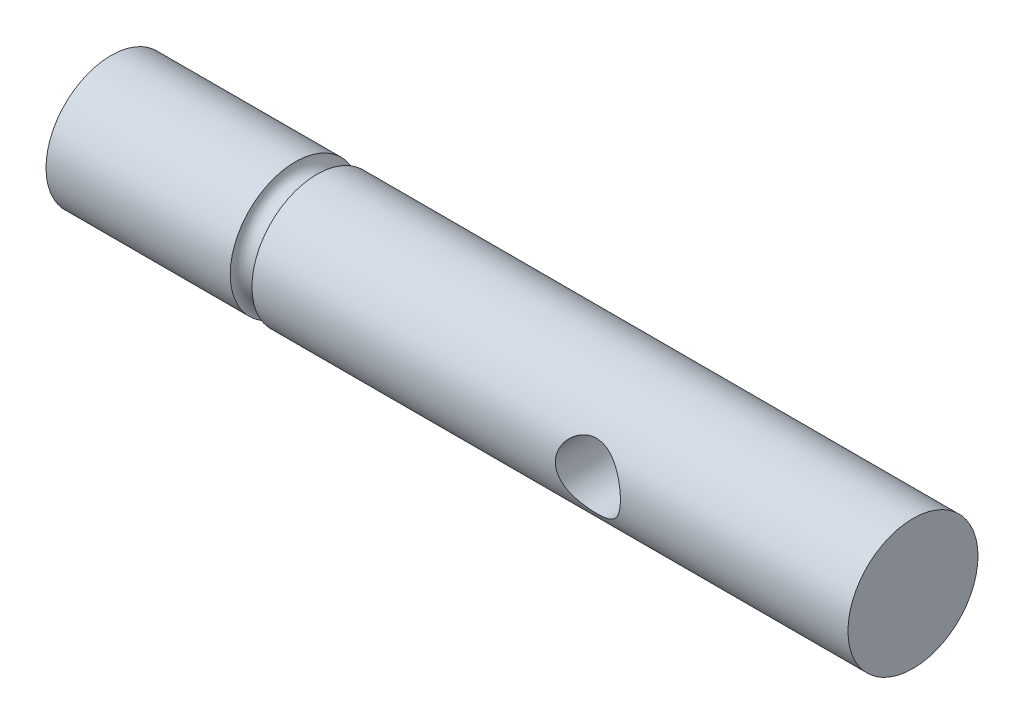
ISO-10303-21;
HEADER;
FILE_DESCRIPTION(('STEP AP214'),'2;1');
FILE_NAME('part.step','',(''),(''),'','','');
FILE_SCHEMA(('AUTOMOTIVE_DESIGN { 1 0 10303 214 1 1 1 1 }'));
ENDSEC;
DATA;
#1=APPLICATION_CONTEXT('core data for automotive mechanical design processes');
#2=APPLICATION_PROTOCOL_DEFINITION('international standard','automotive_design',2000,#1);
#3=PRODUCT_CONTEXT('',#1,'mechanical');
#4=PRODUCT('Part','Part','',(#3));
#5=PRODUCT_RELATED_PRODUCT_CATEGORY('part','',(#4));
#6=PRODUCT_DEFINITION_FORMATION('','',#4);
#7=PRODUCT_DEFINITION_CONTEXT('part definition',#1,'design');
#8=PRODUCT_DEFINITION('design','',#6,#7);
#9=PRODUCT_DEFINITION_SHAPE('','',#8);
#10=(LENGTH_UNIT() NAMED_UNIT(*) SI_UNIT(.MILLI.,.METRE.));
#11=(NAMED_UNIT(*) PLANE_ANGLE_UNIT() SI_UNIT($,.RADIAN.));
#12=(NAMED_UNIT(*) SI_UNIT($,.STERADIAN.) SOLID_ANGLE_UNIT());
#13=UNCERTAINTY_MEASURE_WITH_UNIT(LENGTH_MEASURE(1.E-05),#10,'distance_accuracy_value','');
#14=(GEOMETRIC_REPRESENTATION_CONTEXT(3) GLOBAL_UNCERTAINTY_ASSIGNED_CONTEXT((#13)) GLOBAL_UNIT_ASSIGNED_CONTEXT((#10,
#11,#12)) REPRESENTATION_CONTEXT('',''));
#15=CARTESIAN_POINT('',(0.,0.,0.));
#16=DIRECTION('',(0.,0.,1.));
#17=DIRECTION('',(1.,0.,0.));
#18=AXIS2_PLACEMENT_3D('',#15,#16,#17);
#19=CARTESIAN_POINT('',(18.5,0.,0.));
#20=DIRECTION('',(-1.,0.,0.));
#21=DIRECTION('',(0.,0.,1.));
#22=AXIS2_PLACEMENT_3D('',#19,#20,#21);
#23=CYLINDRICAL_SURFACE('',#22,3.);
#24=CARTESIAN_POINT('',(-10.,0.,0.));
#25=DIRECTION('',(1.,0.,0.));
#26=DIRECTION('',(0.,0.,-1.));
#27=AXIS2_PLACEMENT_3D('',#24,#25,#26);
#28=CIRCLE('',#27,3.);
#29=CARTESIAN_POINT('',(-10.,0.,3.));
#30=VERTEX_POINT('',#29);
#31=EDGE_CURVE('E12',#30,#30,#28,.F.);
#32=ORIENTED_EDGE('',*,*,#31,.T.);
#33=EDGE_LOOP('',(#32));
#34=FACE_BOUND('',#33,.T.);
#35=CARTESIAN_POINT('',(-18.5,0.,0.));
#36=DIRECTION('',(1.,0.,0.));
#37=DIRECTION('',(0.,0.,-1.));
#38=AXIS2_PLACEMENT_3D('',#35,#36,#37);
#39=CIRCLE('',#38,3.);
#40=CARTESIAN_POINT('',(-18.5,0.,-3.));
#41=VERTEX_POINT('',#40);
#42=EDGE_CURVE('E71',#41,#41,#39,.T.);
#43=ORIENTED_EDGE('',*,*,#42,.T.);
#44=EDGE_LOOP('',(#43));
#45=FACE_BOUND('',#44,.T.);
#46=ADVANCED_FACE('F53',(#34,#45),#23,.T.);
#47=CARTESIAN_POINT('',(-18.5,0.,0.));
#48=DIRECTION('',(1.,0.,0.));
#49=DIRECTION('',(0.,0.,-1.));
#50=AXIS2_PLACEMENT_3D('',#47,#48,#49);
#51=PLANE('',#50);
#52=ORIENTED_EDGE('',*,*,#42,.F.);
#53=EDGE_LOOP('',(#52));
#54=FACE_BOUND('',#53,.T.);
#55=ADVANCED_FACE('F105',(#54),#51,.F.);
#56=CARTESIAN_POINT('',(-9.5,0.,0.));
#57=DIRECTION('',(-1.,0.,0.));
#58=DIRECTION('',(0.,0.,1.));
#59=AXIS2_PLACEMENT_3D('',#56,#57,#58);
#60=TOROIDAL_SURFACE('',#59,3.,0.5);
#61=CARTESIAN_POINT('',(-9.5,0.,3.));
#62=DIRECTION('',(0.,1.,0.));
#63=DIRECTION('',(-1.,0.,0.));
#64=AXIS2_PLACEMENT_3D('',#61,#62,#63);
#65=CIRCLE('',#64,0.5);
#66=CARTESIAN_POINT('',(-9.,0.,3.));
#67=VERTEX_POINT('',#66);
#68=EDGE_CURVE('E70',#67,#30,#65,.T.);
#69=ORIENTED_EDGE('',*,*,#68,.F.);
#70=CARTESIAN_POINT('',(-9.,0.,0.));
#71=DIRECTION('',(-1.,0.,0.));
#72=DIRECTION('',(0.,0.,1.));
#73=AXIS2_PLACEMENT_3D('',#70,#71,#72);
#74=CIRCLE('',#73,3.);
#75=EDGE_CURVE('E62',#67,#67,#74,.F.);
#76=ORIENTED_EDGE('',*,*,#75,.F.);
#77=ORIENTED_EDGE('',*,*,#68,.T.);
#78=ORIENTED_EDGE('',*,*,#31,.F.);
#79=EDGE_LOOP('',(#69,#76,#77,#78));
#80=FACE_BOUND('',#79,.T.);
#81=ADVANCED_FACE('F72',(#80),#60,.F.);
#82=CARTESIAN_POINT('',(18.5,0.,0.));
#83=DIRECTION('',(1.,0.,0.));
#84=DIRECTION('',(0.,0.,-1.));
#85=AXIS2_PLACEMENT_3D('',#82,#83,#84);
#86=PLANE('',#85);
#87=CARTESIAN_POINT('',(18.5,0.,0.));
#88=DIRECTION('',(1.,0.,0.));
#89=DIRECTION('',(0.,0.,-1.));
#90=AXIS2_PLACEMENT_3D('',#87,#88,#89);
#91=CIRCLE('',#90,3.);
#92=CARTESIAN_POINT('',(18.5,0.,-3.));
#93=VERTEX_POINT('',#92);
#94=EDGE_CURVE('E78',#93,#93,#91,.T.);
#95=ORIENTED_EDGE('',*,*,#94,.T.);
#96=EDGE_LOOP('',(#95));
#97=FACE_BOUND('',#96,.T.);
#98=ADVANCED_FACE('F100',(#97),#86,.T.);
#99=CARTESIAN_POINT('',(6.5,0.,-3.));
#100=DIRECTION('',(0.,0.,1.));
#101=DIRECTION('',(1.,0.,0.));
#102=AXIS2_PLACEMENT_3D('',#99,#100,#101);
#103=CYLINDRICAL_SURFACE('',#102,1.5);
#104=CARTESIAN_POINT('',(8.,0.,3.));
#105=CARTESIAN_POINT('',(7.99999504652421,-0.0788579444268503,2.99999570107561));
#106=CARTESIAN_POINT('',(7.99374489031841,-0.157809899546344,2.99685736529635));
#107=CARTESIAN_POINT('',(7.96902067948769,-0.313380352903344,2.98461234055736));
#108=CARTESIAN_POINT('',(7.95052341050327,-0.389994130070445,2.97549431743379));
#109=CARTESIAN_POINT('',(7.90220928707506,-0.538400317320674,2.95224419105063));
#110=CARTESIAN_POINT('',(7.87243642362805,-0.61021020440872,2.93813158766306));
#111=CARTESIAN_POINT('',(7.80264406795252,-0.747708925209899,2.90618664773642));
#112=CARTESIAN_POINT('',(7.7626253836267,-0.813398240985089,2.88835460450288));
#113=CARTESIAN_POINT('',(7.67072412577207,-0.941261726642864,2.84934387387093));
#114=CARTESIAN_POINT('',(7.61827028114054,-1.00298281668316,2.82802798691306));
#115=CARTESIAN_POINT('',(7.50421778112945,-1.11716916730047,2.78489955370114));
#116=CARTESIAN_POINT('',(7.44261222234134,-1.16962737466015,2.76308664313552));
#117=CARTESIAN_POINT('',(7.30627497571493,-1.26787800067542,2.71948426796021));
#118=CARTESIAN_POINT('',(7.23089585248113,-1.31283800332746,2.69782780455198));
#119=CARTESIAN_POINT('',(7.07244899602068,-1.38925234033604,2.65928968158481));
#120=CARTESIAN_POINT('',(6.98938680691588,-1.4207163224495,2.64240461410484));
#121=CARTESIAN_POINT('',(6.82300234186712,-1.46719866328288,2.61686800556713));
#122=CARTESIAN_POINT('',(6.73999332189891,-1.48308878562066,2.6077840737557));
#123=CARTESIAN_POINT('',(6.57203174333078,-1.50064048996327,2.59772834922791));
#124=CARTESIAN_POINT('',(6.48708118869327,-1.50231613255961,2.59674854014932));
#125=CARTESIAN_POINT('',(6.32857096352695,-1.49203093075844,2.60266395385873));
#126=CARTESIAN_POINT('',(6.25486395316542,-1.48167683930523,2.6086314549302));
#127=CARTESIAN_POINT('',(6.11041713594044,-1.4504097735854,2.62614343100775));
#128=CARTESIAN_POINT('',(6.03967828204203,-1.42949343584648,2.63768968247664));
#129=CARTESIAN_POINT('',(5.90115630115151,-1.37731467057901,2.66531214619112));
#130=CARTESIAN_POINT('',(5.83348040182132,-1.34582260067399,2.68148760995998));
#131=CARTESIAN_POINT('',(5.70404856111499,-1.27356253150201,2.71655106422105));
#132=CARTESIAN_POINT('',(5.64229529659987,-1.2327903657187,2.73544027170286));
#133=CARTESIAN_POINT('',(5.51821812088516,-1.13709908236918,2.77669736854929));
#134=CARTESIAN_POINT('',(5.45681468963576,-1.08104168755392,2.79920265355119));
#135=CARTESIAN_POINT('',(5.34389687211365,-0.959333368112062,2.84321434950611));
#136=CARTESIAN_POINT('',(5.29238721194917,-0.89367788486143,2.86472027938201));
#137=CARTESIAN_POINT('',(5.19847150845541,-0.750774758747775,2.90552980924446));
#138=CARTESIAN_POINT('',(5.15659929133139,-0.673130387399115,2.92468476243011));
#139=CARTESIAN_POINT('',(5.08685445643548,-0.510699323233197,2.95736821681863));
#140=CARTESIAN_POINT('',(5.05897072247725,-0.425918364397916,2.9709011841533));
#141=CARTESIAN_POINT('',(5.02028689442498,-0.259149737491056,2.98986500612153));
#142=CARTESIAN_POINT('',(5.00826314637983,-0.177512295822492,2.99587407451965));
#143=CARTESIAN_POINT('',(4.99780290329827,-0.0131693999240297,3.00109520188655));
#144=CARTESIAN_POINT('',(4.9993599715408,0.0695355298048612,3.00031048081978));
#145=CARTESIAN_POINT('',(5.01531003262811,0.226849457978979,2.99236788380152));
#146=CARTESIAN_POINT('',(5.02869879909499,0.301589112074894,2.98570868532253));
#147=CARTESIAN_POINT('',(5.06635710784268,0.44761033845291,2.9673325697226));
#148=CARTESIAN_POINT('',(5.09062784968024,0.518891528536629,2.95561509501618));
#149=CARTESIAN_POINT('',(5.14999769964955,0.658332912674358,2.92776377120382));
#150=CARTESIAN_POINT('',(5.18538657517443,0.726345595508704,2.91151322654446));
#151=CARTESIAN_POINT('',(5.26566130346985,0.855692042548907,2.87615961476126));
#152=CARTESIAN_POINT('',(5.31055120189309,0.917022944664887,2.85705533350407));
#153=CARTESIAN_POINT('',(5.41364063799607,1.03765153393382,2.81562332004297));
#154=CARTESIAN_POINT('',(5.47271430266772,1.09615811672854,2.79316327265249));
#155=CARTESIAN_POINT('',(5.59988772691659,1.20278448167828,2.7489358741323));
#156=CARTESIAN_POINT('',(5.66799367827188,1.25089707856781,2.72716901100071));
#157=CARTESIAN_POINT('',(5.81546548125946,1.33756187171853,2.68576788309734));
#158=CARTESIAN_POINT('',(5.89521689914172,1.37553824370037,2.66628794383591));
#159=CARTESIAN_POINT('',(6.06126510136245,1.43712423890206,2.63361108441202));
#160=CARTESIAN_POINT('',(6.14755328970033,1.46075237380052,2.62040607332625));
#161=CARTESIAN_POINT('',(6.31536533432705,1.49079253120031,2.60342251538703));
#162=CARTESIAN_POINT('',(6.39655138015286,1.49863949460818,2.59886075197597));
#163=CARTESIAN_POINT('',(6.55917060074679,1.5010337315643,2.59748031962405));
#164=CARTESIAN_POINT('',(6.64060365310679,1.49558676993486,2.60065829439585));
#165=CARTESIAN_POINT('',(6.79322525230015,1.47288918838996,2.61356793076615));
#166=CARTESIAN_POINT('',(6.86465070521711,1.45681247151455,2.62264641723988));
#167=CARTESIAN_POINT('',(7.00371217913655,1.41476303733662,2.64556524281479));
#168=CARTESIAN_POINT('',(7.07134697313805,1.38878713673988,2.65940711354503));
#169=CARTESIAN_POINT('',(7.2059372764798,1.32572361795085,2.69142795546804));
#170=CARTESIAN_POINT('',(7.27254185274354,1.28800670672355,2.70983583593881));
#171=CARTESIAN_POINT('',(7.39891180427189,1.20322645745609,2.74852997452291));
#172=CARTESIAN_POINT('',(7.45867359578167,1.15615825686234,2.76881720693416));
#173=CARTESIAN_POINT('',(7.57721297353201,1.04730498999206,2.81193484737138));
#174=CARTESIAN_POINT('',(7.63498865352543,0.984426634495892,2.83477474959942));
#175=CARTESIAN_POINT('',(7.7393944751529,0.849232209349796,2.87816628389896));
#176=CARTESIAN_POINT('',(7.78601860920486,0.776911084957796,2.89871667939293));
#177=CARTESIAN_POINT('',(7.8668545440681,0.623897395174418,2.93547014349806));
#178=CARTESIAN_POINT('',(7.9009762538547,0.543149255665095,2.95164144740899));
#179=CARTESIAN_POINT('',(7.95471225163611,0.37611315170713,2.9775201194848));
#180=CARTESIAN_POINT('',(7.97436777020857,0.28984169938365,2.98724585044602));
#181=CARTESIAN_POINT('',(7.99084611662861,0.168902919736343,2.99543192870217));
#182=CARTESIAN_POINT('',(7.99427396129951,0.135242819162347,2.99714048010376));
#183=CARTESIAN_POINT('',(7.99885199827113,0.0677275977076369,2.99942545465223));
#184=CARTESIAN_POINT('',(8.00000212770531,0.0338724714699424,3.00000184655071));
#185=CARTESIAN_POINT('',(8.,0.,3.));
#186=B_SPLINE_CURVE_WITH_KNOTS('',3,(#104,#105,#106,#107,#108,#109,#110,#111,#112,#113,#114,
#115,#116,#117,#118,#119,#120,#121,#122,#123,#124,#125,#126,#127,#128,#129,#130,#131,#132,#133,
#134,#135,#136,#137,#138,#139,#140,#141,#142,#143,#144,#145,#146,#147,#148,#149,#150,#151,#152,
#153,#154,#155,#156,#157,#158,#159,#160,#161,#162,#163,#164,#165,#166,#167,#168,#169,#170,#171,
#172,#173,#174,#175,#176,#177,#178,#179,#180,#181,#182,#183,#184,#185),.UNSPECIFIED.,.T.,.F.,(4,
2,2,2,2,2,2,2,2,2,2,2,2,2,2,2,2,2,2,2,2,2,2,2,2,2,2,2,2,2,2,2,2,2,2,2,2,2,2,2,4),(0.,
0.236436386130439,0.473322224563797,0.709293233238448,0.945245640872352,1.19547263807713,
1.44588935648105,1.71572589646129,1.98536921847421,2.23887018210344,2.49212035993531,
2.71508568613981,2.93812205888518,3.16635360252731,3.39468781890333,3.65197412000818,
3.9093830189803,4.17874533321661,4.4478932536842,4.69474935707019,4.94148846767214,
5.16910359759183,5.39674382446398,5.63089284041848,5.86514176122509,6.12239415966629,
6.37982382923148,6.64972023242589,6.91926767918176,7.1629396125457,7.40650589797018,
7.62686895373284,7.84730293182527,8.08254685170431,8.31791341715446,8.58187864135757,
8.84598575071869,9.1119602049529,9.37717362931724,9.47872920200876,9.58028757766599),.UNSPECIFIED.);
#187=CARTESIAN_POINT('',(8.,0.,3.));
#188=VERTEX_POINT('',#187);
#189=EDGE_CURVE('E76',#188,#188,#186,.T.);
#190=ORIENTED_EDGE('',*,*,#189,.F.);
#191=EDGE_LOOP('',(#190));
#192=FACE_BOUND('',#191,.T.);
#193=CARTESIAN_POINT('',(8.,0.,-3.));
#194=CARTESIAN_POINT('',(7.99999504652421,0.0788579444268494,-2.99999570107562));
#195=CARTESIAN_POINT('',(7.99374489031841,0.157809899546343,-2.99685736529635));
#196=CARTESIAN_POINT('',(7.96902067948769,0.313380352903343,-2.98461234055736));
#197=CARTESIAN_POINT('',(7.95052341050328,0.389994130070444,-2.97549431743379));
#198=CARTESIAN_POINT('',(7.90220928707506,0.538400317320673,-2.95224419105063));
#199=CARTESIAN_POINT('',(7.87243642362805,0.610210204408719,-2.93813158766306));
#200=CARTESIAN_POINT('',(7.80264406795252,0.747708925209897,-2.90618664773642));
#201=CARTESIAN_POINT('',(7.7626253836267,0.813398240985088,-2.88835460450288));
#202=CARTESIAN_POINT('',(7.67072412577207,0.941261726642863,-2.84934387387093));
#203=CARTESIAN_POINT('',(7.61827028114054,1.00298281668316,-2.82802798691306));
#204=CARTESIAN_POINT('',(7.50421778112944,1.11716916730047,-2.78489955370115));
#205=CARTESIAN_POINT('',(7.44261222234134,1.16962737466015,-2.76308664313552));
#206=CARTESIAN_POINT('',(7.30627497571493,1.26787800067542,-2.71948426796021));
#207=CARTESIAN_POINT('',(7.23089585248113,1.31283800332746,-2.69782780455198));
#208=CARTESIAN_POINT('',(7.07244899602068,1.38925234033604,-2.65928968158481));
#209=CARTESIAN_POINT('',(6.98938680691588,1.4207163224495,-2.64240461410484));
#210=CARTESIAN_POINT('',(6.82300234186712,1.46719866328288,-2.61686800556713));
#211=CARTESIAN_POINT('',(6.73999332189891,1.48308878562066,-2.6077840737557));
#212=CARTESIAN_POINT('',(6.57203174333078,1.50064048996327,-2.59772834922792));
#213=CARTESIAN_POINT('',(6.48708118869327,1.50231613255961,-2.59674854014932));
#214=CARTESIAN_POINT('',(6.32857096352695,1.49203093075844,-2.60266395385873));
#215=CARTESIAN_POINT('',(6.25486395316542,1.48167683930523,-2.6086314549302));
#216=CARTESIAN_POINT('',(6.11041713594044,1.4504097735854,-2.62614343100775));
#217=CARTESIAN_POINT('',(6.03967828204202,1.42949343584648,-2.63768968247664));
#218=CARTESIAN_POINT('',(5.90115630115151,1.37731467057901,-2.66531214619112));
#219=CARTESIAN_POINT('',(5.83348040182132,1.34582260067399,-2.68148760995998));
#220=CARTESIAN_POINT('',(5.70404856111499,1.273562531502,-2.71655106422106));
#221=CARTESIAN_POINT('',(5.64229529659987,1.2327903657187,-2.73544027170286));
#222=CARTESIAN_POINT('',(5.51821812088516,1.13709908236918,-2.77669736854929));
#223=CARTESIAN_POINT('',(5.45681468963576,1.08104168755392,-2.79920265355119));
#224=CARTESIAN_POINT('',(5.34389687211365,0.95933336811206,-2.84321434950611));
#225=CARTESIAN_POINT('',(5.29238721194917,0.893677884861428,-2.86472027938201));
#226=CARTESIAN_POINT('',(5.19847150845541,0.750774758747773,-2.90552980924446));
#227=CARTESIAN_POINT('',(5.15659929133139,0.673130387399113,-2.92468476243011));
#228=CARTESIAN_POINT('',(5.08685445643548,0.510699323233195,-2.95736821681863));
#229=CARTESIAN_POINT('',(5.05897072247725,0.425918364397914,-2.9709011841533));
#230=CARTESIAN_POINT('',(5.02028689442498,0.259149737491053,-2.98986500612153));
#231=CARTESIAN_POINT('',(5.00826314637983,0.177512295822489,-2.99587407451965));
#232=CARTESIAN_POINT('',(4.99780290329827,0.0131693999240272,-3.00109520188655));
#233=CARTESIAN_POINT('',(4.9993599715408,-0.0695355298048633,-3.00031048081978));
#234=CARTESIAN_POINT('',(5.01531003262811,-0.226849457978981,-2.99236788380152));
#235=CARTESIAN_POINT('',(5.02869879909499,-0.301589112074895,-2.98570868532252));
#236=CARTESIAN_POINT('',(5.06635710784268,-0.447610338452912,-2.9673325697226));
#237=CARTESIAN_POINT('',(5.09062784968024,-0.518891528536631,-2.95561509501618));
#238=CARTESIAN_POINT('',(5.14999769964955,-0.658332912674359,-2.92776377120382));
#239=CARTESIAN_POINT('',(5.18538657517443,-0.726345595508705,-2.91151322654446));
#240=CARTESIAN_POINT('',(5.26566130346985,-0.855692042548907,-2.87615961476126));
#241=CARTESIAN_POINT('',(5.31055120189309,-0.917022944664888,-2.85705533350407));
#242=CARTESIAN_POINT('',(5.41364063799607,-1.03765153393382,-2.81562332004297));
#243=CARTESIAN_POINT('',(5.47271430266772,-1.09615811672854,-2.79316327265249));
#244=CARTESIAN_POINT('',(5.59988772691659,-1.20278448167828,-2.7489358741323));
#245=CARTESIAN_POINT('',(5.66799367827188,-1.25089707856781,-2.72716901100071));
#246=CARTESIAN_POINT('',(5.81546548125946,-1.33756187171853,-2.68576788309734));
#247=CARTESIAN_POINT('',(5.89521689914172,-1.37553824370037,-2.66628794383591));
#248=CARTESIAN_POINT('',(6.06126510136245,-1.43712423890206,-2.63361108441202));
#249=CARTESIAN_POINT('',(6.14755328970033,-1.46075237380053,-2.62040607332625));
#250=CARTESIAN_POINT('',(6.31536533432705,-1.49079253120031,-2.60342251538703));
#251=CARTESIAN_POINT('',(6.39655138015286,-1.49863949460818,-2.59886075197597));
#252=CARTESIAN_POINT('',(6.55917060074679,-1.5010337315643,-2.59748031962405));
#253=CARTESIAN_POINT('',(6.64060365310679,-1.49558676993486,-2.60065829439585));
#254=CARTESIAN_POINT('',(6.79322525230015,-1.47288918838997,-2.61356793076615));
#255=CARTESIAN_POINT('',(6.86465070521711,-1.45681247151455,-2.62264641723988));
#256=CARTESIAN_POINT('',(7.00371217913655,-1.41476303733662,-2.64556524281479));
#257=CARTESIAN_POINT('',(7.07134697313805,-1.38878713673988,-2.65940711354503));
#258=CARTESIAN_POINT('',(7.2059372764798,-1.32572361795085,-2.69142795546803));
#259=CARTESIAN_POINT('',(7.27254185274354,-1.28800670672355,-2.70983583593881));
#260=CARTESIAN_POINT('',(7.39891180427189,-1.20322645745609,-2.7485299745229));
#261=CARTESIAN_POINT('',(7.45867359578167,-1.15615825686235,-2.76881720693416));
#262=CARTESIAN_POINT('',(7.57721297353201,-1.04730498999206,-2.81193484737138));
#263=CARTESIAN_POINT('',(7.63498865352543,-0.984426634495894,-2.83477474959942));
#264=CARTESIAN_POINT('',(7.7393944751529,-0.849232209349797,-2.87816628389896));
#265=CARTESIAN_POINT('',(7.78601860920486,-0.776911084957797,-2.89871667939293));
#266=CARTESIAN_POINT('',(7.8668545440681,-0.62389739517442,-2.93547014349806));
#267=CARTESIAN_POINT('',(7.9009762538547,-0.543149255665097,-2.95164144740899));
#268=CARTESIAN_POINT('',(7.95471225163611,-0.376113151707131,-2.9775201194848));
#269=CARTESIAN_POINT('',(7.97436777020857,-0.289841699383652,-2.98724585044602));
#270=CARTESIAN_POINT('',(7.99084611662861,-0.168902919736345,-2.99543192870217));
#271=CARTESIAN_POINT('',(7.99427396129951,-0.135242819162349,-2.99714048010376));
#272=CARTESIAN_POINT('',(7.99885199827113,-0.0677275977076386,-2.99942545465223));
#273=CARTESIAN_POINT('',(8.00000212770531,-0.0338724714699437,-3.00000184655071));
#274=CARTESIAN_POINT('',(8.,0.,-3.));
#275=B_SPLINE_CURVE_WITH_KNOTS('',3,(#193,#194,#195,#196,#197,#198,#199,#200,#201,#202,#203,
#204,#205,#206,#207,#208,#209,#210,#211,#212,#213,#214,#215,#216,#217,#218,#219,#220,#221,#222,
#223,#224,#225,#226,#227,#228,#229,#230,#231,#232,#233,#234,#235,#236,#237,#238,#239,#240,#241,
#242,#243,#244,#245,#246,#247,#248,#249,#250,#251,#252,#253,#254,#255,#256,#257,#258,#259,#260,
#261,#262,#263,#264,#265,#266,#267,#268,#269,#270,#271,#272,#273,#274),.UNSPECIFIED.,.T.,.F.,(4,
2,2,2,2,2,2,2,2,2,2,2,2,2,2,2,2,2,2,2,2,2,2,2,2,2,2,2,2,2,2,2,2,2,2,2,2,2,2,2,4),(0.,
0.236436386130439,0.473322224563796,0.709293233238448,0.945245640872351,1.19547263807713,
1.44588935648105,1.71572589646129,1.98536921847421,2.23887018210344,2.49212035993531,
2.71508568613981,2.93812205888518,3.16635360252731,3.39468781890333,3.65197412000818,
3.9093830189803,4.17874533321661,4.44789325368419,4.69474935707019,4.94148846767214,
5.16910359759183,5.39674382446397,5.63089284041848,5.86514176122509,6.12239415966628,
6.37982382923148,6.64972023242589,6.91926767918176,7.1629396125457,7.40650589797018,
7.62686895373284,7.84730293182527,8.08254685170431,8.31791341715446,8.58187864135758,
8.84598575071869,9.1119602049529,9.37717362931724,9.47872920200876,9.580287577666),.UNSPECIFIED.);
#276=CARTESIAN_POINT('',(8.,0.,-3.));
#277=VERTEX_POINT('',#276);
#278=EDGE_CURVE('E86',#277,#277,#275,.T.);
#279=ORIENTED_EDGE('',*,*,#278,.F.);
#280=EDGE_LOOP('',(#279));
#281=FACE_BOUND('',#280,.T.);
#282=ADVANCED_FACE('F95',(#192,#281),#103,.F.);
#283=ORIENTED_EDGE('',*,*,#75,.T.);
#284=EDGE_LOOP('',(#283));
#285=FACE_BOUND('',#284,.T.);
#286=ORIENTED_EDGE('',*,*,#278,.T.);
#287=EDGE_LOOP('',(#286));
#288=FACE_BOUND('',#287,.T.);
#289=ORIENTED_EDGE('',*,*,#189,.T.);
#290=EDGE_LOOP('',(#289));
#291=FACE_BOUND('',#290,.T.);
#292=ORIENTED_EDGE('',*,*,#94,.F.);
#293=EDGE_LOOP('',(#292));
#294=FACE_BOUND('',#293,.T.);
#295=ADVANCED_FACE('F57',(#285,#288,#291,#294),#23,.T.);
#296=CLOSED_SHELL('',(#46,#55,#81,#98,#282,#295));
#297=MANIFOLD_SOLID_BREP('B2',#296);
#298=ADVANCED_BREP_SHAPE_REPRESENTATION('',(#18,#297),#14);
#299=SHAPE_DEFINITION_REPRESENTATION(#9,#298);
ENDSEC;
END-ISO-10303-21;
